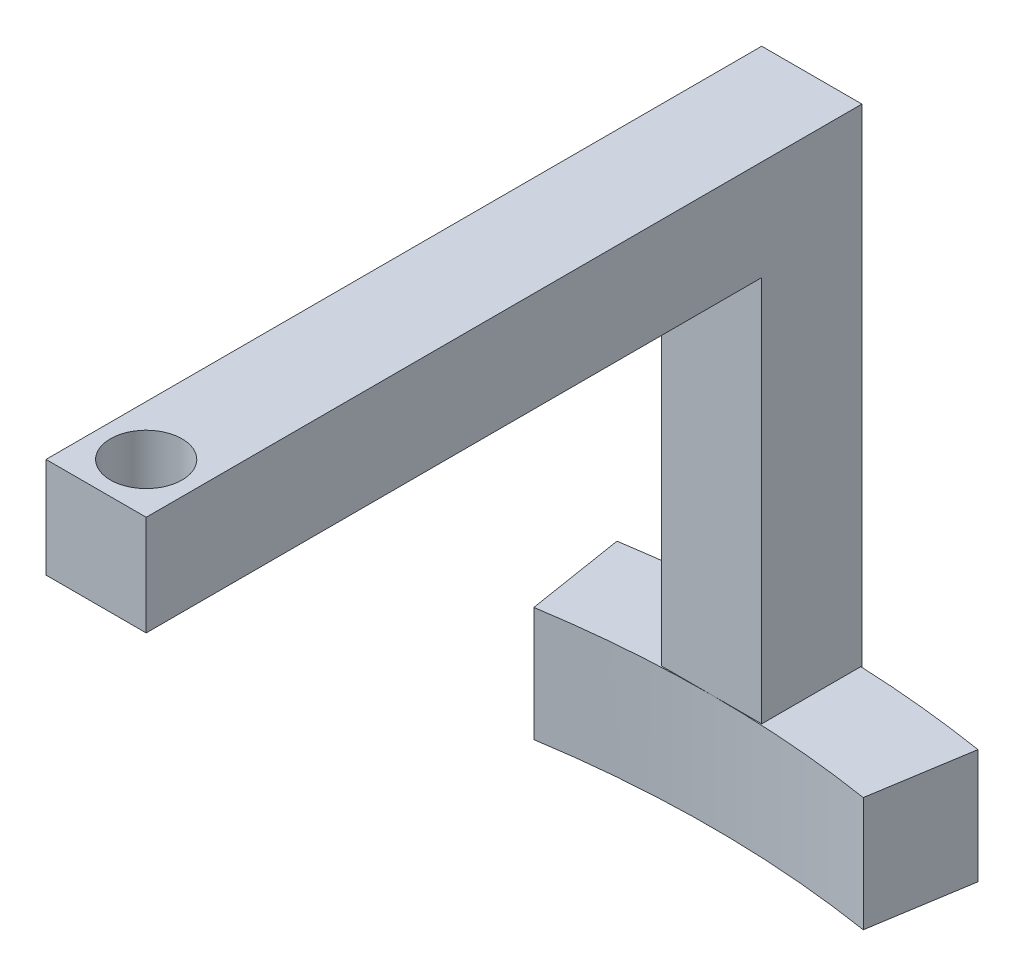
ISO-10303-21;
HEADER;
FILE_DESCRIPTION(('STEP AP214'),'2;1');
FILE_NAME('part.step','',(''),(''),'','','');
FILE_SCHEMA(('AUTOMOTIVE_DESIGN { 1 0 10303 214 1 1 1 1 }'));
ENDSEC;
DATA;
#1=APPLICATION_CONTEXT('core data for automotive mechanical design processes');
#2=APPLICATION_PROTOCOL_DEFINITION('international standard','automotive_design',2000,#1);
#3=PRODUCT_CONTEXT('',#1,'mechanical');
#4=PRODUCT('Part','Part','',(#3));
#5=PRODUCT_RELATED_PRODUCT_CATEGORY('part','',(#4));
#6=PRODUCT_DEFINITION_FORMATION('','',#4);
#7=PRODUCT_DEFINITION_CONTEXT('part definition',#1,'design');
#8=PRODUCT_DEFINITION('design','',#6,#7);
#9=PRODUCT_DEFINITION_SHAPE('','',#8);
#10=(LENGTH_UNIT() NAMED_UNIT(*) SI_UNIT(.MILLI.,.METRE.));
#11=(NAMED_UNIT(*) PLANE_ANGLE_UNIT() SI_UNIT($,.RADIAN.));
#12=(NAMED_UNIT(*) SI_UNIT($,.STERADIAN.) SOLID_ANGLE_UNIT());
#13=UNCERTAINTY_MEASURE_WITH_UNIT(LENGTH_MEASURE(1.E-05),#10,'distance_accuracy_value','');
#14=(GEOMETRIC_REPRESENTATION_CONTEXT(3) GLOBAL_UNCERTAINTY_ASSIGNED_CONTEXT((#13)) GLOBAL_UNIT_ASSIGNED_CONTEXT((#10,
#11,#12)) REPRESENTATION_CONTEXT('',''));
#15=CARTESIAN_POINT('',(0.,0.,0.));
#16=DIRECTION('',(0.,0.,1.));
#17=DIRECTION('',(1.,0.,0.));
#18=AXIS2_PLACEMENT_3D('',#15,#16,#17);
#19=CARTESIAN_POINT('',(3.5,9.37499999999986,-21.5));
#20=DIRECTION('',(0.,0.,-1.));
#21=DIRECTION('',(-1.,0.,0.));
#22=AXIS2_PLACEMENT_3D('',#19,#20,#21);
#23=PLANE('',#22);
#24=DIRECTION('',(-1.,0.,0.));
#25=VECTOR('',#24,1.);
#26=CARTESIAN_POINT('',(3.5,13.3749999999999,-21.5));
#27=LINE('',#26,#25);
#28=CARTESIAN_POINT('',(3.5,13.3749999999999,-21.5));
#29=VERTEX_POINT('',#28);
#30=CARTESIAN_POINT('',(1.75,13.3749999999999,-21.5));
#31=VERTEX_POINT('',#30);
#32=EDGE_CURVE('E272',#29,#31,#27,.T.);
#33=ORIENTED_EDGE('',*,*,#32,.F.);
#34=DIRECTION('',(0.,-1.,0.));
#35=VECTOR('',#34,1.);
#36=CARTESIAN_POINT('',(3.5,9.37499999999986,-21.5));
#37=LINE('',#36,#35);
#38=CARTESIAN_POINT('',(3.5,26.8749999999999,-21.5));
#39=VERTEX_POINT('',#38);
#40=EDGE_CURVE('E115',#39,#29,#37,.T.);
#41=ORIENTED_EDGE('',*,*,#40,.F.);
#42=DIRECTION('',(-1.,0.,0.));
#43=VECTOR('',#42,1.);
#44=CARTESIAN_POINT('',(3.5,26.8749999999999,-21.5));
#45=LINE('',#44,#43);
#46=CARTESIAN_POINT('',(0.,26.8749999999999,-21.5));
#47=VERTEX_POINT('',#46);
#48=EDGE_CURVE('E125',#39,#47,#45,.T.);
#49=ORIENTED_EDGE('',*,*,#48,.T.);
#50=DIRECTION('',(0.,-1.,0.));
#51=VECTOR('',#50,1.);
#52=CARTESIAN_POINT('',(0.,9.37499999999986,-21.5));
#53=LINE('',#52,#51);
#54=CARTESIAN_POINT('',(0.,13.3749999999999,-21.5));
#55=VERTEX_POINT('',#54);
#56=EDGE_CURVE('E143',#47,#55,#53,.T.);
#57=ORIENTED_EDGE('',*,*,#56,.T.);
#58=EDGE_CURVE('E181',#31,#55,#27,.T.);
#59=ORIENTED_EDGE('',*,*,#58,.F.);
#60=EDGE_LOOP('',(#33,#41,#49,#57,#59));
#61=FACE_BOUND('',#60,.T.);
#62=ADVANCED_FACE('F39',(#61),#23,.F.);
#63=CARTESIAN_POINT('',(3.5,26.8749999999999,0.));
#64=DIRECTION('',(0.,0.,-1.));
#65=DIRECTION('',(-1.,0.,0.));
#66=AXIS2_PLACEMENT_3D('',#63,#64,#65);
#67=PLANE('',#66);
#68=DIRECTION('',(0.,-1.,0.));
#69=VECTOR('',#68,1.);
#70=CARTESIAN_POINT('',(0.,26.8749999999999,0.));
#71=LINE('',#70,#69);
#72=CARTESIAN_POINT('',(0.,30.3749999999999,0.));
#73=VERTEX_POINT('',#72);
#74=CARTESIAN_POINT('',(0.,26.8749999999999,0.));
#75=VERTEX_POINT('',#74);
#76=EDGE_CURVE('E136',#73,#75,#71,.T.);
#77=ORIENTED_EDGE('',*,*,#76,.T.);
#78=DIRECTION('',(-1.,0.,0.));
#79=VECTOR('',#78,1.);
#80=CARTESIAN_POINT('',(3.5,26.8749999999999,0.));
#81=LINE('',#80,#79);
#82=CARTESIAN_POINT('',(3.5,26.8749999999999,0.));
#83=VERTEX_POINT('',#82);
#84=EDGE_CURVE('E162',#83,#75,#81,.T.);
#85=ORIENTED_EDGE('',*,*,#84,.F.);
#86=DIRECTION('',(0.,-1.,0.));
#87=VECTOR('',#86,1.);
#88=CARTESIAN_POINT('',(3.5,26.8749999999999,0.));
#89=LINE('',#88,#87);
#90=CARTESIAN_POINT('',(3.5,30.3749999999999,0.));
#91=VERTEX_POINT('',#90);
#92=EDGE_CURVE('E154',#91,#83,#89,.T.);
#93=ORIENTED_EDGE('',*,*,#92,.F.);
#94=DIRECTION('',(-1.,0.,0.));
#95=VECTOR('',#94,1.);
#96=CARTESIAN_POINT('',(3.5,30.3749999999999,0.));
#97=LINE('',#96,#95);
#98=EDGE_CURVE('E132',#91,#73,#97,.T.);
#99=ORIENTED_EDGE('',*,*,#98,.T.);
#100=EDGE_LOOP('',(#77,#85,#93,#99));
#101=FACE_BOUND('',#100,.T.);
#102=ADVANCED_FACE('F41',(#101),#67,.F.);
#103=CARTESIAN_POINT('',(3.5,26.8749999999999,-21.5));
#104=DIRECTION('',(0.,1.,0.));
#105=DIRECTION('',(0.,0.,1.));
#106=AXIS2_PLACEMENT_3D('',#103,#104,#105);
#107=PLANE('',#106);
#108=CARTESIAN_POINT('',(1.75,26.8749999999999,-1.75));
#109=DIRECTION('',(0.,1.,0.));
#110=DIRECTION('',(0.,0.,1.));
#111=AXIS2_PLACEMENT_3D('',#108,#109,#110);
#112=CIRCLE('',#111,1.25);
#113=CARTESIAN_POINT('',(1.75,26.8749999999999,-0.500000000000002));
#114=VERTEX_POINT('',#113);
#115=EDGE_CURVE('E214',#114,#114,#112,.T.);
#116=ORIENTED_EDGE('',*,*,#115,.T.);
#117=EDGE_LOOP('',(#116));
#118=FACE_BOUND('',#117,.T.);
#119=DIRECTION('',(0.,0.,-1.));
#120=VECTOR('',#119,1.);
#121=CARTESIAN_POINT('',(0.,26.8749999999999,-21.5));
#122=LINE('',#121,#120);
#123=EDGE_CURVE('E140',#75,#47,#122,.T.);
#124=ORIENTED_EDGE('',*,*,#123,.T.);
#125=ORIENTED_EDGE('',*,*,#48,.F.);
#126=DIRECTION('',(0.,0.,-1.));
#127=VECTOR('',#126,1.);
#128=CARTESIAN_POINT('',(3.5,26.8749999999999,-21.5));
#129=LINE('',#128,#127);
#130=EDGE_CURVE('E96',#83,#39,#129,.T.);
#131=ORIENTED_EDGE('',*,*,#130,.F.);
#132=ORIENTED_EDGE('',*,*,#84,.T.);
#133=EDGE_LOOP('',(#124,#125,#131,#132));
#134=FACE_BOUND('',#133,.T.);
#135=ADVANCED_FACE('F184',(#118,#134),#107,.F.);
#136=CARTESIAN_POINT('',(3.5,9.37499999999986,-25.));
#137=DIRECTION('',(0.,1.,0.));
#138=DIRECTION('',(0.,0.,1.));
#139=AXIS2_PLACEMENT_3D('',#136,#137,#138);
#140=PLANE('',#139);
#141=CARTESIAN_POINT('',(1.75,9.37499999999986,15.));
#142=DIRECTION('',(0.,1.,0.));
#143=DIRECTION('',(0.,0.,-1.));
#144=AXIS2_PLACEMENT_3D('',#141,#142,#143);
#145=CIRCLE('',#144,36.5);
#146=CARTESIAN_POINT('',(7.50309359714402,9.37499999999986,-21.04375));
#147=VERTEX_POINT('',#146);
#148=CARTESIAN_POINT('',(-4.00309359714403,9.37499999999986,-21.04375));
#149=VERTEX_POINT('',#148);
#150=EDGE_CURVE('E249',#147,#149,#145,.T.);
#151=ORIENTED_EDGE('',*,*,#150,.T.);
#152=DIRECTION('',(-0.157619002661478,0.,-0.9875));
#153=VECTOR('',#152,1.);
#154=CARTESIAN_POINT('',(-4.5547601064592,9.37499999999986,-24.5));
#155=LINE('',#154,#153);
#156=CARTESIAN_POINT('',(-4.5547601064592,9.37499999999986,-24.5));
#157=VERTEX_POINT('',#156);
#158=EDGE_CURVE('E252',#149,#157,#155,.T.);
#159=ORIENTED_EDGE('',*,*,#158,.T.);
#160=CARTESIAN_POINT('',(1.75,9.37499999999986,15.));
#161=DIRECTION('',(0.,-1.,0.));
#162=DIRECTION('',(0.,0.,-1.));
#163=AXIS2_PLACEMENT_3D('',#160,#161,#162);
#164=CIRCLE('',#163,40.);
#165=CARTESIAN_POINT('',(0.,9.37499999999986,-24.9617004142717));
#166=VERTEX_POINT('',#165);
#167=EDGE_CURVE('E55',#157,#166,#164,.T.);
#168=ORIENTED_EDGE('',*,*,#167,.T.);
#169=DIRECTION('',(0.,0.,-1.));
#170=VECTOR('',#169,1.);
#171=CARTESIAN_POINT('',(0.,9.37499999999986,-25.));
#172=LINE('',#171,#170);
#173=CARTESIAN_POINT('',(0.,9.37499999999986,-25.));
#174=VERTEX_POINT('',#173);
#175=EDGE_CURVE('E121',#166,#174,#172,.T.);
#176=ORIENTED_EDGE('',*,*,#175,.T.);
#177=DIRECTION('',(-1.,0.,0.));
#178=VECTOR('',#177,1.);
#179=CARTESIAN_POINT('',(3.5,9.37499999999986,-25.));
#180=LINE('',#179,#178);
#181=CARTESIAN_POINT('',(3.5,9.37499999999986,-25.));
#182=VERTEX_POINT('',#181);
#183=EDGE_CURVE('E117',#182,#174,#180,.T.);
#184=ORIENTED_EDGE('',*,*,#183,.F.);
#185=DIRECTION('',(0.,0.,-1.));
#186=VECTOR('',#185,1.);
#187=CARTESIAN_POINT('',(3.5,9.37499999999986,-25.));
#188=LINE('',#187,#186);
#189=CARTESIAN_POINT('',(3.5,9.37499999999986,-24.9617004142717));
#190=VERTEX_POINT('',#189);
#191=EDGE_CURVE('E103',#190,#182,#188,.T.);
#192=ORIENTED_EDGE('',*,*,#191,.F.);
#193=CARTESIAN_POINT('',(8.0547601064592,9.37499999999986,-24.5));
#194=VERTEX_POINT('',#193);
#195=EDGE_CURVE('E217',#190,#194,#164,.T.);
#196=ORIENTED_EDGE('',*,*,#195,.T.);
#197=DIRECTION('',(-0.157619002661482,0.,0.9875));
#198=VECTOR('',#197,1.);
#199=CARTESIAN_POINT('',(7.50309359714402,9.37499999999986,-21.04375));
#200=LINE('',#199,#198);
#201=EDGE_CURVE('E245',#194,#147,#200,.T.);
#202=ORIENTED_EDGE('',*,*,#201,.T.);
#203=EDGE_LOOP('',(#151,#159,#168,#176,#184,#192,#196,#202));
#204=FACE_BOUND('',#203,.T.);
#205=ADVANCED_FACE('F119',(#204),#140,.F.);
#206=CARTESIAN_POINT('',(3.5,30.3749999999999,-25.));
#207=DIRECTION('',(0.,0.,1.));
#208=DIRECTION('',(0.,-1.,0.));
#209=AXIS2_PLACEMENT_3D('',#206,#207,#208);
#210=PLANE('',#209);
#211=ORIENTED_EDGE('',*,*,#183,.T.);
#212=DIRECTION('',(0.,1.,0.));
#213=VECTOR('',#212,1.);
#214=CARTESIAN_POINT('',(0.,30.3749999999999,-25.));
#215=LINE('',#214,#213);
#216=CARTESIAN_POINT('',(0.,30.3749999999999,-25.));
#217=VERTEX_POINT('',#216);
#218=EDGE_CURVE('E149',#174,#217,#215,.T.);
#219=ORIENTED_EDGE('',*,*,#218,.T.);
#220=DIRECTION('',(-1.,0.,0.));
#221=VECTOR('',#220,1.);
#222=CARTESIAN_POINT('',(3.5,30.3749999999999,-25.));
#223=LINE('',#222,#221);
#224=CARTESIAN_POINT('',(3.5,30.3749999999999,-25.));
#225=VERTEX_POINT('',#224);
#226=EDGE_CURVE('E126',#225,#217,#223,.T.);
#227=ORIENTED_EDGE('',*,*,#226,.F.);
#228=DIRECTION('',(0.,1.,0.));
#229=VECTOR('',#228,1.);
#230=CARTESIAN_POINT('',(3.5,30.3749999999999,-25.));
#231=LINE('',#230,#229);
#232=EDGE_CURVE('E108',#182,#225,#231,.T.);
#233=ORIENTED_EDGE('',*,*,#232,.F.);
#234=EDGE_LOOP('',(#211,#219,#227,#233));
#235=FACE_BOUND('',#234,.T.);
#236=ADVANCED_FACE('F128',(#235),#210,.F.);
#237=CARTESIAN_POINT('',(3.5,30.3749999999999,0.));
#238=DIRECTION('',(0.,-1.,0.));
#239=DIRECTION('',(0.,0.,-1.));
#240=AXIS2_PLACEMENT_3D('',#237,#238,#239);
#241=PLANE('',#240);
#242=CARTESIAN_POINT('',(1.75,30.3749999999999,-1.75));
#243=DIRECTION('',(0.,1.,0.));
#244=DIRECTION('',(0.,0.,1.));
#245=AXIS2_PLACEMENT_3D('',#242,#243,#244);
#246=CIRCLE('',#245,1.25);
#247=CARTESIAN_POINT('',(1.75,30.3749999999999,-0.500000000000002));
#248=VERTEX_POINT('',#247);
#249=EDGE_CURVE('E218',#248,#248,#246,.T.);
#250=ORIENTED_EDGE('',*,*,#249,.F.);
#251=EDGE_LOOP('',(#250));
#252=FACE_BOUND('',#251,.T.);
#253=DIRECTION('',(0.,0.,1.));
#254=VECTOR('',#253,1.);
#255=CARTESIAN_POINT('',(0.,30.3749999999999,0.));
#256=LINE('',#255,#254);
#257=EDGE_CURVE('E87',#217,#73,#256,.T.);
#258=ORIENTED_EDGE('',*,*,#257,.T.);
#259=ORIENTED_EDGE('',*,*,#98,.F.);
#260=DIRECTION('',(0.,0.,1.));
#261=VECTOR('',#260,1.);
#262=CARTESIAN_POINT('',(3.5,30.3749999999999,0.));
#263=LINE('',#262,#261);
#264=EDGE_CURVE('E63',#225,#91,#263,.T.);
#265=ORIENTED_EDGE('',*,*,#264,.F.);
#266=ORIENTED_EDGE('',*,*,#226,.T.);
#267=EDGE_LOOP('',(#258,#259,#265,#266));
#268=FACE_BOUND('',#267,.T.);
#269=ADVANCED_FACE('F189',(#252,#268),#241,.F.);
#270=CARTESIAN_POINT('',(3.5,0.,0.));
#271=DIRECTION('',(-1.,0.,0.));
#272=DIRECTION('',(0.,0.,1.));
#273=AXIS2_PLACEMENT_3D('',#270,#271,#272);
#274=PLANE('',#273);
#275=DIRECTION('',(0.,0.,1.));
#276=VECTOR('',#275,1.);
#277=CARTESIAN_POINT('',(3.5,13.3749999999999,0.));
#278=LINE('',#277,#276);
#279=CARTESIAN_POINT('',(3.5,13.3749999999999,-24.9617004142717));
#280=VERTEX_POINT('',#279);
#281=EDGE_CURVE('E273',#280,#29,#278,.T.);
#282=ORIENTED_EDGE('',*,*,#281,.F.);
#283=DIRECTION('',(0.,-1.,0.));
#284=VECTOR('',#283,1.);
#285=CARTESIAN_POINT('',(3.5,13.3749999999999,-24.9617004142717));
#286=LINE('',#285,#284);
#287=EDGE_CURVE('E112',#280,#190,#286,.T.);
#288=ORIENTED_EDGE('',*,*,#287,.T.);
#289=ORIENTED_EDGE('',*,*,#191,.T.);
#290=ORIENTED_EDGE('',*,*,#232,.T.);
#291=ORIENTED_EDGE('',*,*,#264,.T.);
#292=ORIENTED_EDGE('',*,*,#92,.T.);
#293=ORIENTED_EDGE('',*,*,#130,.T.);
#294=ORIENTED_EDGE('',*,*,#40,.T.);
#295=EDGE_LOOP('',(#282,#288,#289,#290,#291,#292,#293,#294));
#296=FACE_BOUND('',#295,.T.);
#297=ADVANCED_FACE('F106',(#296),#274,.F.);
#298=CARTESIAN_POINT('',(0.,0.,0.));
#299=DIRECTION('',(-1.,0.,0.));
#300=DIRECTION('',(0.,0.,1.));
#301=AXIS2_PLACEMENT_3D('',#298,#299,#300);
#302=PLANE('',#301);
#303=DIRECTION('',(0.,-1.,0.));
#304=VECTOR('',#303,1.);
#305=CARTESIAN_POINT('',(0.,13.3749999999999,-24.9617004142717));
#306=LINE('',#305,#304);
#307=CARTESIAN_POINT('',(0.,13.3749999999999,-24.9617004142717));
#308=VERTEX_POINT('',#307);
#309=EDGE_CURVE('E11',#308,#166,#306,.T.);
#310=ORIENTED_EDGE('',*,*,#309,.F.);
#311=DIRECTION('',(0.,0.,1.));
#312=VECTOR('',#311,1.);
#313=CARTESIAN_POINT('',(0.,13.3749999999999,0.));
#314=LINE('',#313,#312);
#315=EDGE_CURVE('E48',#308,#55,#314,.T.);
#316=ORIENTED_EDGE('',*,*,#315,.T.);
#317=ORIENTED_EDGE('',*,*,#56,.F.);
#318=ORIENTED_EDGE('',*,*,#123,.F.);
#319=ORIENTED_EDGE('',*,*,#76,.F.);
#320=ORIENTED_EDGE('',*,*,#257,.F.);
#321=ORIENTED_EDGE('',*,*,#218,.F.);
#322=ORIENTED_EDGE('',*,*,#175,.F.);
#323=EDGE_LOOP('',(#310,#316,#317,#318,#319,#320,#321,#322));
#324=FACE_BOUND('',#323,.T.);
#325=ADVANCED_FACE('F171',(#324),#302,.T.);
#326=CARTESIAN_POINT('',(1.75,13.3749999999999,15.));
#327=DIRECTION('',(0.,-1.,0.));
#328=DIRECTION('',(0.,0.,-1.));
#329=AXIS2_PLACEMENT_3D('',#326,#327,#328);
#330=CYLINDRICAL_SURFACE('',#329,36.5);
#331=CARTESIAN_POINT('',(1.75,13.3749999999999,15.));
#332=DIRECTION('',(0.,1.,0.));
#333=DIRECTION('',(0.,0.,-1.));
#334=AXIS2_PLACEMENT_3D('',#331,#332,#333);
#335=CIRCLE('',#334,36.5);
#336=CARTESIAN_POINT('',(7.50309359714402,13.3749999999999,-21.04375));
#337=VERTEX_POINT('',#336);
#338=EDGE_CURVE('E235',#337,#31,#335,.T.);
#339=ORIENTED_EDGE('',*,*,#338,.T.);
#340=CARTESIAN_POINT('',(-4.00309359714403,13.3749999999999,-21.04375));
#341=VERTEX_POINT('',#340);
#342=EDGE_CURVE('E234',#31,#341,#335,.T.);
#343=ORIENTED_EDGE('',*,*,#342,.T.);
#344=DIRECTION('',(0.,-1.,0.));
#345=VECTOR('',#344,1.);
#346=CARTESIAN_POINT('',(-4.00309359714403,13.3749999999999,-21.04375));
#347=LINE('',#346,#345);
#348=EDGE_CURVE('E259',#341,#149,#347,.T.);
#349=ORIENTED_EDGE('',*,*,#348,.T.);
#350=ORIENTED_EDGE('',*,*,#150,.F.);
#351=DIRECTION('',(0.,-1.,0.));
#352=VECTOR('',#351,1.);
#353=CARTESIAN_POINT('',(7.50309359714402,13.3749999999999,-21.04375));
#354=LINE('',#353,#352);
#355=EDGE_CURVE('E263',#337,#147,#354,.T.);
#356=ORIENTED_EDGE('',*,*,#355,.F.);
#357=EDGE_LOOP('',(#339,#343,#349,#350,#356));
#358=FACE_BOUND('',#357,.T.);
#359=ADVANCED_FACE('F312',(#358),#330,.F.);
#360=CARTESIAN_POINT('',(1.75,13.3749999999999,15.));
#361=DIRECTION('',(0.,-1.,0.));
#362=DIRECTION('',(0.,0.,-1.));
#363=AXIS2_PLACEMENT_3D('',#360,#361,#362);
#364=CYLINDRICAL_SURFACE('',#363,40.);
#365=ORIENTED_EDGE('',*,*,#287,.F.);
#366=CARTESIAN_POINT('',(1.75,13.3749999999999,15.));
#367=DIRECTION('',(0.,-1.,0.));
#368=DIRECTION('',(0.,0.,-1.));
#369=AXIS2_PLACEMENT_3D('',#366,#367,#368);
#370=CIRCLE('',#369,40.);
#371=CARTESIAN_POINT('',(8.0547601064592,13.3749999999999,-24.5));
#372=VERTEX_POINT('',#371);
#373=EDGE_CURVE('E230',#280,#372,#370,.T.);
#374=ORIENTED_EDGE('',*,*,#373,.T.);
#375=DIRECTION('',(0.,-1.,0.));
#376=VECTOR('',#375,1.);
#377=CARTESIAN_POINT('',(8.0547601064592,13.3749999999999,-24.5));
#378=LINE('',#377,#376);
#379=EDGE_CURVE('E242',#372,#194,#378,.T.);
#380=ORIENTED_EDGE('',*,*,#379,.T.);
#381=ORIENTED_EDGE('',*,*,#195,.F.);
#382=EDGE_LOOP('',(#365,#374,#380,#381));
#383=FACE_BOUND('',#382,.T.);
#384=ADVANCED_FACE('F299',(#383),#364,.T.);
#385=CARTESIAN_POINT('',(1.75,13.3749999999999,15.));
#386=DIRECTION('',(0.,-1.,0.));
#387=DIRECTION('',(0.,0.,-1.));
#388=AXIS2_PLACEMENT_3D('',#385,#386,#387);
#389=PLANE('',#388);
#390=ORIENTED_EDGE('',*,*,#373,.F.);
#391=ORIENTED_EDGE('',*,*,#281,.T.);
#392=ORIENTED_EDGE('',*,*,#32,.T.);
#393=ORIENTED_EDGE('',*,*,#338,.F.);
#394=DIRECTION('',(-0.157619002661482,0.,0.9875));
#395=VECTOR('',#394,1.);
#396=CARTESIAN_POINT('',(7.50309359714402,13.3749999999999,-21.04375));
#397=LINE('',#396,#395);
#398=EDGE_CURVE('E229',#372,#337,#397,.T.);
#399=ORIENTED_EDGE('',*,*,#398,.F.);
#400=EDGE_LOOP('',(#390,#391,#392,#393,#399));
#401=FACE_BOUND('',#400,.T.);
#402=ADVANCED_FACE('F287',(#401),#389,.F.);
#403=ORIENTED_EDGE('',*,*,#342,.F.);
#404=ORIENTED_EDGE('',*,*,#58,.T.);
#405=ORIENTED_EDGE('',*,*,#315,.F.);
#406=CARTESIAN_POINT('',(-4.5547601064592,13.3749999999999,-24.5));
#407=VERTEX_POINT('',#406);
#408=EDGE_CURVE('E226',#407,#308,#370,.T.);
#409=ORIENTED_EDGE('',*,*,#408,.F.);
#410=DIRECTION('',(-0.157619002661478,0.,-0.9875));
#411=VECTOR('',#410,1.);
#412=CARTESIAN_POINT('',(-4.5547601064592,13.3749999999999,-24.5));
#413=LINE('',#412,#411);
#414=EDGE_CURVE('E239',#341,#407,#413,.T.);
#415=ORIENTED_EDGE('',*,*,#414,.F.);
#416=EDGE_LOOP('',(#403,#404,#405,#409,#415));
#417=FACE_BOUND('',#416,.T.);
#418=ADVANCED_FACE('F334',(#417),#389,.F.);
#419=ORIENTED_EDGE('',*,*,#408,.T.);
#420=ORIENTED_EDGE('',*,*,#309,.T.);
#421=ORIENTED_EDGE('',*,*,#167,.F.);
#422=DIRECTION('',(0.,-1.,0.));
#423=VECTOR('',#422,1.);
#424=CARTESIAN_POINT('',(-4.5547601064592,13.3749999999999,-24.5));
#425=LINE('',#424,#423);
#426=EDGE_CURVE('E255',#407,#157,#425,.T.);
#427=ORIENTED_EDGE('',*,*,#426,.F.);
#428=EDGE_LOOP('',(#419,#420,#421,#427));
#429=FACE_BOUND('',#428,.T.);
#430=ADVANCED_FACE('F330',(#429),#364,.T.);
#431=CARTESIAN_POINT('',(-4.5547601064592,13.3749999999999,-24.5));
#432=DIRECTION('',(-0.9875,0.,0.157619002661478));
#433=DIRECTION('',(0.157619002661478,0.,0.9875));
#434=AXIS2_PLACEMENT_3D('',#431,#432,#433);
#435=PLANE('',#434);
#436=ORIENTED_EDGE('',*,*,#158,.F.);
#437=ORIENTED_EDGE('',*,*,#348,.F.);
#438=ORIENTED_EDGE('',*,*,#414,.T.);
#439=ORIENTED_EDGE('',*,*,#426,.T.);
#440=EDGE_LOOP('',(#436,#437,#438,#439));
#441=FACE_BOUND('',#440,.T.);
#442=ADVANCED_FACE('F335',(#441),#435,.T.);
#443=CARTESIAN_POINT('',(7.50309359714402,13.3749999999999,-21.04375));
#444=DIRECTION('',(0.9875,0.,0.157619002661482));
#445=DIRECTION('',(0.157619002661482,0.,-0.9875));
#446=AXIS2_PLACEMENT_3D('',#443,#444,#445);
#447=PLANE('',#446);
#448=ORIENTED_EDGE('',*,*,#201,.F.);
#449=ORIENTED_EDGE('',*,*,#379,.F.);
#450=ORIENTED_EDGE('',*,*,#398,.T.);
#451=ORIENTED_EDGE('',*,*,#355,.T.);
#452=EDGE_LOOP('',(#448,#449,#450,#451));
#453=FACE_BOUND('',#452,.T.);
#454=ADVANCED_FACE('F307',(#453),#447,.T.);
#455=CARTESIAN_POINT('',(1.75,26.3749999999999,-1.75));
#456=DIRECTION('',(0.,1.,0.));
#457=DIRECTION('',(0.,0.,1.));
#458=AXIS2_PLACEMENT_3D('',#455,#456,#457);
#459=CYLINDRICAL_SURFACE('',#458,1.25);
#460=ORIENTED_EDGE('',*,*,#249,.T.);
#461=EDGE_LOOP('',(#460));
#462=FACE_BOUND('',#461,.T.);
#463=ORIENTED_EDGE('',*,*,#115,.F.);
#464=EDGE_LOOP('',(#463));
#465=FACE_BOUND('',#464,.T.);
#466=ADVANCED_FACE('F342',(#462,#465),#459,.F.);
#467=CLOSED_SHELL('',(#62,#102,#135,#205,#236,#269,#297,#325,#359,#384,#402,#418,#430,#442,#454,#466));
#468=MANIFOLD_SOLID_BREP('B2',#467);
#469=ADVANCED_BREP_SHAPE_REPRESENTATION('',(#18,#468),#14);
#470=SHAPE_DEFINITION_REPRESENTATION(#9,#469);
ENDSEC;
END-ISO-10303-21;
